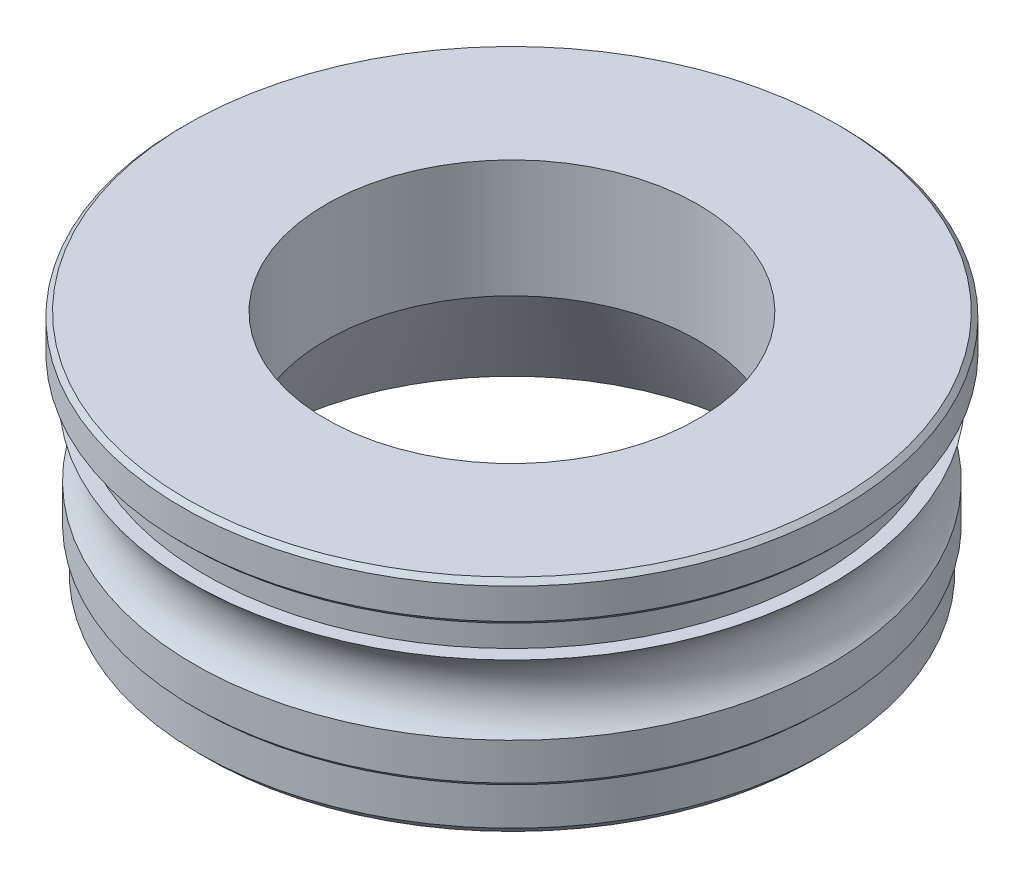
ISO-10303-21;
HEADER;
FILE_DESCRIPTION(('STEP AP214'),'2;1');
FILE_NAME('part.step','',(''),(''),'','','');
FILE_SCHEMA(('AUTOMOTIVE_DESIGN { 1 0 10303 214 1 1 1 1 }'));
ENDSEC;
DATA;
#1=APPLICATION_CONTEXT('core data for automotive mechanical design processes');
#2=APPLICATION_PROTOCOL_DEFINITION('international standard','automotive_design',2000,#1);
#3=PRODUCT_CONTEXT('',#1,'mechanical');
#4=PRODUCT('Part','Part','',(#3));
#5=PRODUCT_RELATED_PRODUCT_CATEGORY('part','',(#4));
#6=PRODUCT_DEFINITION_FORMATION('','',#4);
#7=PRODUCT_DEFINITION_CONTEXT('part definition',#1,'design');
#8=PRODUCT_DEFINITION('design','',#6,#7);
#9=PRODUCT_DEFINITION_SHAPE('','',#8);
#10=(LENGTH_UNIT() NAMED_UNIT(*) SI_UNIT(.MILLI.,.METRE.));
#11=(NAMED_UNIT(*) PLANE_ANGLE_UNIT() SI_UNIT($,.RADIAN.));
#12=(NAMED_UNIT(*) SI_UNIT($,.STERADIAN.) SOLID_ANGLE_UNIT());
#13=UNCERTAINTY_MEASURE_WITH_UNIT(LENGTH_MEASURE(1.E-05),#10,'distance_accuracy_value','');
#14=(GEOMETRIC_REPRESENTATION_CONTEXT(3) GLOBAL_UNCERTAINTY_ASSIGNED_CONTEXT((#13)) GLOBAL_UNIT_ASSIGNED_CONTEXT((#10,
#11,#12)) REPRESENTATION_CONTEXT('',''));
#15=CARTESIAN_POINT('',(0.,0.,0.));
#16=DIRECTION('',(0.,0.,1.));
#17=DIRECTION('',(1.,0.,0.));
#18=AXIS2_PLACEMENT_3D('',#15,#16,#17);
#19=CARTESIAN_POINT('',(5.39337567297407,0.,0.));
#20=DIRECTION('',(0.,-1.,0.));
#21=DIRECTION('',(0.,0.,-1.));
#22=AXIS2_PLACEMENT_3D('',#19,#20,#21);
#23=PLANE('',#22);
#24=CARTESIAN_POINT('',(0.,0.,0.));
#25=DIRECTION('',(0.,-1.,0.));
#26=DIRECTION('',(0.,0.,-1.));
#27=AXIS2_PLACEMENT_3D('',#24,#25,#26);
#28=CIRCLE('',#27,6.45);
#29=CARTESIAN_POINT('',(0.,0.,-6.45));
#30=VERTEX_POINT('',#29);
#31=EDGE_CURVE('E82',#30,#30,#28,.T.);
#32=ORIENTED_EDGE('',*,*,#31,.T.);
#33=EDGE_LOOP('',(#32));
#34=FACE_BOUND('',#33,.T.);
#35=CARTESIAN_POINT('',(0.,0.,0.));
#36=DIRECTION('',(0.,-1.,0.));
#37=DIRECTION('',(0.,0.,-1.));
#38=AXIS2_PLACEMENT_3D('',#35,#36,#37);
#39=CIRCLE('',#38,5.39337567297407);
#40=CARTESIAN_POINT('',(0.,0.,-5.39337567297407));
#41=VERTEX_POINT('',#40);
#42=EDGE_CURVE('E10',#41,#41,#39,.T.);
#43=ORIENTED_EDGE('',*,*,#42,.F.);
#44=EDGE_LOOP('',(#43));
#45=FACE_BOUND('',#44,.T.);
#46=ADVANCED_FACE('F33',(#34,#45),#23,.T.);
#47=CARTESIAN_POINT('',(0.,2.5,0.));
#48=DIRECTION('',(0.,-1.,0.));
#49=DIRECTION('',(0.,0.,-1.));
#50=AXIS2_PLACEMENT_3D('',#47,#48,#49);
#51=CONICAL_SURFACE('',#50,3.95,0.523598775598301);
#52=ORIENTED_EDGE('',*,*,#42,.T.);
#53=EDGE_LOOP('',(#52));
#54=FACE_BOUND('',#53,.T.);
#55=CARTESIAN_POINT('',(0.,2.5,0.));
#56=DIRECTION('',(0.,-1.,0.));
#57=DIRECTION('',(0.,0.,-1.));
#58=AXIS2_PLACEMENT_3D('',#55,#56,#57);
#59=CIRCLE('',#58,3.95);
#60=CARTESIAN_POINT('',(0.,2.5,-3.95));
#61=VERTEX_POINT('',#60);
#62=EDGE_CURVE('E39',#61,#61,#59,.T.);
#63=ORIENTED_EDGE('',*,*,#62,.F.);
#64=EDGE_LOOP('',(#63));
#65=FACE_BOUND('',#64,.T.);
#66=ADVANCED_FACE('F100',(#54,#65),#51,.F.);
#67=CARTESIAN_POINT('',(0.,0.,0.));
#68=DIRECTION('',(0.,-1.,0.));
#69=DIRECTION('',(0.,0.,-1.));
#70=AXIS2_PLACEMENT_3D('',#67,#68,#69);
#71=CYLINDRICAL_SURFACE('',#70,3.95);
#72=ORIENTED_EDGE('',*,*,#62,.T.);
#73=EDGE_LOOP('',(#72));
#74=FACE_BOUND('',#73,.T.);
#75=CARTESIAN_POINT('',(0.,5.,0.));
#76=DIRECTION('',(0.,-1.,0.));
#77=DIRECTION('',(0.,0.,-1.));
#78=AXIS2_PLACEMENT_3D('',#75,#76,#77);
#79=CIRCLE('',#78,3.95);
#80=CARTESIAN_POINT('',(0.,5.,-3.95));
#81=VERTEX_POINT('',#80);
#82=EDGE_CURVE('E43',#81,#81,#79,.T.);
#83=ORIENTED_EDGE('',*,*,#82,.F.);
#84=EDGE_LOOP('',(#83));
#85=FACE_BOUND('',#84,.T.);
#86=ADVANCED_FACE('F104',(#74,#85),#71,.F.);
#87=CARTESIAN_POINT('',(3.95,5.,0.));
#88=DIRECTION('',(0.,1.,0.));
#89=DIRECTION('',(0.,0.,1.));
#90=AXIS2_PLACEMENT_3D('',#87,#88,#89);
#91=PLANE('',#90);
#92=ORIENTED_EDGE('',*,*,#82,.T.);
#93=EDGE_LOOP('',(#92));
#94=FACE_BOUND('',#93,.T.);
#95=CARTESIAN_POINT('',(0.,5.,0.));
#96=DIRECTION('',(0.,-1.,0.));
#97=DIRECTION('',(0.,0.,-1.));
#98=AXIS2_PLACEMENT_3D('',#95,#96,#97);
#99=CIRCLE('',#98,6.9);
#100=CARTESIAN_POINT('',(0.,5.,-6.9));
#101=VERTEX_POINT('',#100);
#102=EDGE_CURVE('E47',#101,#101,#99,.T.);
#103=ORIENTED_EDGE('',*,*,#102,.F.);
#104=EDGE_LOOP('',(#103));
#105=FACE_BOUND('',#104,.T.);
#106=ADVANCED_FACE('F108',(#94,#105),#91,.T.);
#107=CARTESIAN_POINT('',(0.,4.9,0.));
#108=DIRECTION('',(0.,-1.,0.));
#109=DIRECTION('',(0.,0.,-1.));
#110=AXIS2_PLACEMENT_3D('',#107,#108,#109);
#111=CONICAL_SURFACE('',#110,7.,0.785398163397448);
#112=ORIENTED_EDGE('',*,*,#102,.T.);
#113=EDGE_LOOP('',(#112));
#114=FACE_BOUND('',#113,.T.);
#115=CARTESIAN_POINT('',(0.,4.9,0.));
#116=DIRECTION('',(0.,-1.,0.));
#117=DIRECTION('',(0.,0.,-1.));
#118=AXIS2_PLACEMENT_3D('',#115,#116,#117);
#119=CIRCLE('',#118,7.);
#120=CARTESIAN_POINT('',(0.,4.9,-7.));
#121=VERTEX_POINT('',#120);
#122=EDGE_CURVE('E52',#121,#121,#119,.T.);
#123=ORIENTED_EDGE('',*,*,#122,.F.);
#124=EDGE_LOOP('',(#123));
#125=FACE_BOUND('',#124,.T.);
#126=ADVANCED_FACE('F114',(#114,#125),#111,.T.);
#127=CARTESIAN_POINT('',(0.,0.,0.));
#128=DIRECTION('',(0.,-1.,0.));
#129=DIRECTION('',(0.,0.,-1.));
#130=AXIS2_PLACEMENT_3D('',#127,#128,#129);
#131=CYLINDRICAL_SURFACE('',#130,7.);
#132=ORIENTED_EDGE('',*,*,#122,.T.);
#133=EDGE_LOOP('',(#132));
#134=FACE_BOUND('',#133,.T.);
#135=CARTESIAN_POINT('',(0.,4.25,0.));
#136=DIRECTION('',(0.,-1.,0.));
#137=DIRECTION('',(0.,0.,-1.));
#138=AXIS2_PLACEMENT_3D('',#135,#136,#137);
#139=CIRCLE('',#138,7.);
#140=CARTESIAN_POINT('',(0.,4.25,-7.));
#141=VERTEX_POINT('',#140);
#142=EDGE_CURVE('E55',#141,#141,#139,.T.);
#143=ORIENTED_EDGE('',*,*,#142,.F.);
#144=EDGE_LOOP('',(#143));
#145=FACE_BOUND('',#144,.T.);
#146=ADVANCED_FACE('F118',(#134,#145),#131,.T.);
#147=CARTESIAN_POINT('',(0.,4.15,0.));
#148=DIRECTION('',(0.,1.,0.));
#149=DIRECTION('',(0.,0.,1.));
#150=AXIS2_PLACEMENT_3D('',#147,#148,#149);
#151=CONICAL_SURFACE('',#150,6.9,0.785398163397448);
#152=ORIENTED_EDGE('',*,*,#142,.T.);
#153=EDGE_LOOP('',(#152));
#154=FACE_BOUND('',#153,.T.);
#155=CARTESIAN_POINT('',(0.,4.15,0.));
#156=DIRECTION('',(0.,-1.,0.));
#157=DIRECTION('',(0.,0.,-1.));
#158=AXIS2_PLACEMENT_3D('',#155,#156,#157);
#159=CIRCLE('',#158,6.9);
#160=CARTESIAN_POINT('',(0.,4.15,-6.9));
#161=VERTEX_POINT('',#160);
#162=EDGE_CURVE('E58',#161,#161,#159,.T.);
#163=ORIENTED_EDGE('',*,*,#162,.F.);
#164=EDGE_LOOP('',(#163));
#165=FACE_BOUND('',#164,.T.);
#166=ADVANCED_FACE('F122',(#154,#165),#151,.T.);
#167=CARTESIAN_POINT('',(6.9,4.15,0.));
#168=DIRECTION('',(0.,-1.,0.));
#169=DIRECTION('',(0.,0.,-1.));
#170=AXIS2_PLACEMENT_3D('',#167,#168,#169);
#171=PLANE('',#170);
#172=ORIENTED_EDGE('',*,*,#162,.T.);
#173=EDGE_LOOP('',(#172));
#174=FACE_BOUND('',#173,.T.);
#175=CARTESIAN_POINT('',(0.,4.15,0.));
#176=DIRECTION('',(0.,-1.,0.));
#177=DIRECTION('',(0.,0.,-1.));
#178=AXIS2_PLACEMENT_3D('',#175,#176,#177);
#179=CIRCLE('',#178,6.5);
#180=CARTESIAN_POINT('',(0.,4.15,-6.5));
#181=VERTEX_POINT('',#180);
#182=EDGE_CURVE('E61',#181,#181,#179,.T.);
#183=ORIENTED_EDGE('',*,*,#182,.F.);
#184=EDGE_LOOP('',(#183));
#185=FACE_BOUND('',#184,.T.);
#186=ADVANCED_FACE('F126',(#174,#185),#171,.T.);
#187=CARTESIAN_POINT('',(0.,0.,0.));
#188=DIRECTION('',(0.,-1.,0.));
#189=DIRECTION('',(0.,0.,-1.));
#190=AXIS2_PLACEMENT_3D('',#187,#188,#189);
#191=CYLINDRICAL_SURFACE('',#190,6.5);
#192=ORIENTED_EDGE('',*,*,#182,.T.);
#193=EDGE_LOOP('',(#192));
#194=FACE_BOUND('',#193,.T.);
#195=CARTESIAN_POINT('',(0.,3.4,0.));
#196=DIRECTION('',(0.,-1.,0.));
#197=DIRECTION('',(0.,0.,-1.));
#198=AXIS2_PLACEMENT_3D('',#195,#196,#197);
#199=CIRCLE('',#198,6.5);
#200=CARTESIAN_POINT('',(0.,3.4,-6.5));
#201=VERTEX_POINT('',#200);
#202=EDGE_CURVE('E64',#201,#201,#199,.T.);
#203=ORIENTED_EDGE('',*,*,#202,.F.);
#204=EDGE_LOOP('',(#203));
#205=FACE_BOUND('',#204,.T.);
#206=ADVANCED_FACE('F130',(#194,#205),#191,.T.);
#207=CARTESIAN_POINT('',(6.5,3.4,0.));
#208=DIRECTION('',(0.,1.,0.));
#209=DIRECTION('',(0.,0.,1.));
#210=AXIS2_PLACEMENT_3D('',#207,#208,#209);
#211=PLANE('',#210);
#212=ORIENTED_EDGE('',*,*,#202,.T.);
#213=EDGE_LOOP('',(#212));
#214=FACE_BOUND('',#213,.T.);
#215=CARTESIAN_POINT('',(0.,3.4,0.));
#216=DIRECTION('',(0.,-1.,0.));
#217=DIRECTION('',(0.,0.,-1.));
#218=AXIS2_PLACEMENT_3D('',#215,#216,#217);
#219=CIRCLE('',#218,6.8);
#220=CARTESIAN_POINT('',(0.,3.4,-6.8));
#221=VERTEX_POINT('',#220);
#222=EDGE_CURVE('E67',#221,#221,#219,.T.);
#223=ORIENTED_EDGE('',*,*,#222,.F.);
#224=EDGE_LOOP('',(#223));
#225=FACE_BOUND('',#224,.T.);
#226=ADVANCED_FACE('F134',(#214,#225),#211,.T.);
#227=CARTESIAN_POINT('',(0.,2.62284833400189,0.));
#228=DIRECTION('',(0.,-1.,0.));
#229=DIRECTION('',(0.,0.,-1.));
#230=AXIS2_PLACEMENT_3D('',#227,#228,#229);
#231=TOROIDAL_SURFACE('',#230,7.42931334646292,1.);
#232=ORIENTED_EDGE('',*,*,#222,.T.);
#233=EDGE_LOOP('',(#232));
#234=FACE_BOUND('',#233,.T.);
#235=CARTESIAN_POINT('',(0.,1.889,0.));
#236=DIRECTION('',(0.,-1.,0.));
#237=DIRECTION('',(0.,0.,-1.));
#238=AXIS2_PLACEMENT_3D('',#235,#236,#237);
#239=CIRCLE('',#238,6.75);
#240=CARTESIAN_POINT('',(0.,1.889,-6.75));
#241=VERTEX_POINT('',#240);
#242=EDGE_CURVE('E70',#241,#241,#239,.T.);
#243=ORIENTED_EDGE('',*,*,#242,.F.);
#244=EDGE_LOOP('',(#243));
#245=FACE_BOUND('',#244,.T.);
#246=ADVANCED_FACE('F138',(#234,#245),#231,.F.);
#247=CARTESIAN_POINT('',(0.,0.,0.));
#248=DIRECTION('',(0.,-1.,0.));
#249=DIRECTION('',(0.,0.,-1.));
#250=AXIS2_PLACEMENT_3D('',#247,#248,#249);
#251=CYLINDRICAL_SURFACE('',#250,6.75);
#252=ORIENTED_EDGE('',*,*,#242,.T.);
#253=EDGE_LOOP('',(#252));
#254=FACE_BOUND('',#253,.T.);
#255=CARTESIAN_POINT('',(0.,1.1,0.));
#256=DIRECTION('',(0.,-1.,0.));
#257=DIRECTION('',(0.,0.,-1.));
#258=AXIS2_PLACEMENT_3D('',#255,#256,#257);
#259=CIRCLE('',#258,6.75);
#260=CARTESIAN_POINT('',(0.,1.1,-6.75));
#261=VERTEX_POINT('',#260);
#262=EDGE_CURVE('E73',#261,#261,#259,.T.);
#263=ORIENTED_EDGE('',*,*,#262,.F.);
#264=EDGE_LOOP('',(#263));
#265=FACE_BOUND('',#264,.T.);
#266=ADVANCED_FACE('F142',(#254,#265),#251,.T.);
#267=CARTESIAN_POINT('',(0.,1.,0.));
#268=DIRECTION('',(0.,1.,0.));
#269=DIRECTION('',(0.,0.,1.));
#270=AXIS2_PLACEMENT_3D('',#267,#268,#269);
#271=CONICAL_SURFACE('',#270,6.65,0.785398163397441);
#272=ORIENTED_EDGE('',*,*,#262,.T.);
#273=EDGE_LOOP('',(#272));
#274=FACE_BOUND('',#273,.T.);
#275=CARTESIAN_POINT('',(0.,1.,0.));
#276=DIRECTION('',(0.,-1.,0.));
#277=DIRECTION('',(0.,0.,-1.));
#278=AXIS2_PLACEMENT_3D('',#275,#276,#277);
#279=CIRCLE('',#278,6.65);
#280=CARTESIAN_POINT('',(0.,1.,-6.65));
#281=VERTEX_POINT('',#280);
#282=EDGE_CURVE('E76',#281,#281,#279,.T.);
#283=ORIENTED_EDGE('',*,*,#282,.F.);
#284=EDGE_LOOP('',(#283));
#285=FACE_BOUND('',#284,.T.);
#286=ADVANCED_FACE('F96',(#274,#285),#271,.T.);
#287=CARTESIAN_POINT('',(0.,0.,0.));
#288=DIRECTION('',(0.,-1.,0.));
#289=DIRECTION('',(0.,0.,-1.));
#290=AXIS2_PLACEMENT_3D('',#287,#288,#289);
#291=CYLINDRICAL_SURFACE('',#290,6.65);
#292=ORIENTED_EDGE('',*,*,#282,.T.);
#293=EDGE_LOOP('',(#292));
#294=FACE_BOUND('',#293,.T.);
#295=CARTESIAN_POINT('',(0.,0.2,0.));
#296=DIRECTION('',(0.,-1.,0.));
#297=DIRECTION('',(0.,0.,-1.));
#298=AXIS2_PLACEMENT_3D('',#295,#296,#297);
#299=CIRCLE('',#298,6.65);
#300=CARTESIAN_POINT('',(0.,0.2,-6.65));
#301=VERTEX_POINT('',#300);
#302=EDGE_CURVE('E79',#301,#301,#299,.T.);
#303=ORIENTED_EDGE('',*,*,#302,.F.);
#304=EDGE_LOOP('',(#303));
#305=FACE_BOUND('',#304,.T.);
#306=ADVANCED_FACE('F90',(#294,#305),#291,.T.);
#307=CARTESIAN_POINT('',(0.,0.,0.));
#308=DIRECTION('',(0.,1.,0.));
#309=DIRECTION('',(0.,0.,1.));
#310=AXIS2_PLACEMENT_3D('',#307,#308,#309);
#311=CONICAL_SURFACE('',#310,6.45,0.785398163397443);
#312=ORIENTED_EDGE('',*,*,#302,.T.);
#313=EDGE_LOOP('',(#312));
#314=FACE_BOUND('',#313,.T.);
#315=ORIENTED_EDGE('',*,*,#31,.F.);
#316=EDGE_LOOP('',(#315));
#317=FACE_BOUND('',#316,.T.);
#318=ADVANCED_FACE('F88',(#314,#317),#311,.T.);
#319=CLOSED_SHELL('',(#46,#66,#86,#106,#126,#146,#166,#186,#206,#226,#246,#266,#286,#306,#318));
#320=MANIFOLD_SOLID_BREP('B2',#319);
#321=ADVANCED_BREP_SHAPE_REPRESENTATION('',(#18,#320),#14);
#322=SHAPE_DEFINITION_REPRESENTATION(#9,#321);
ENDSEC;
END-ISO-10303-21;
